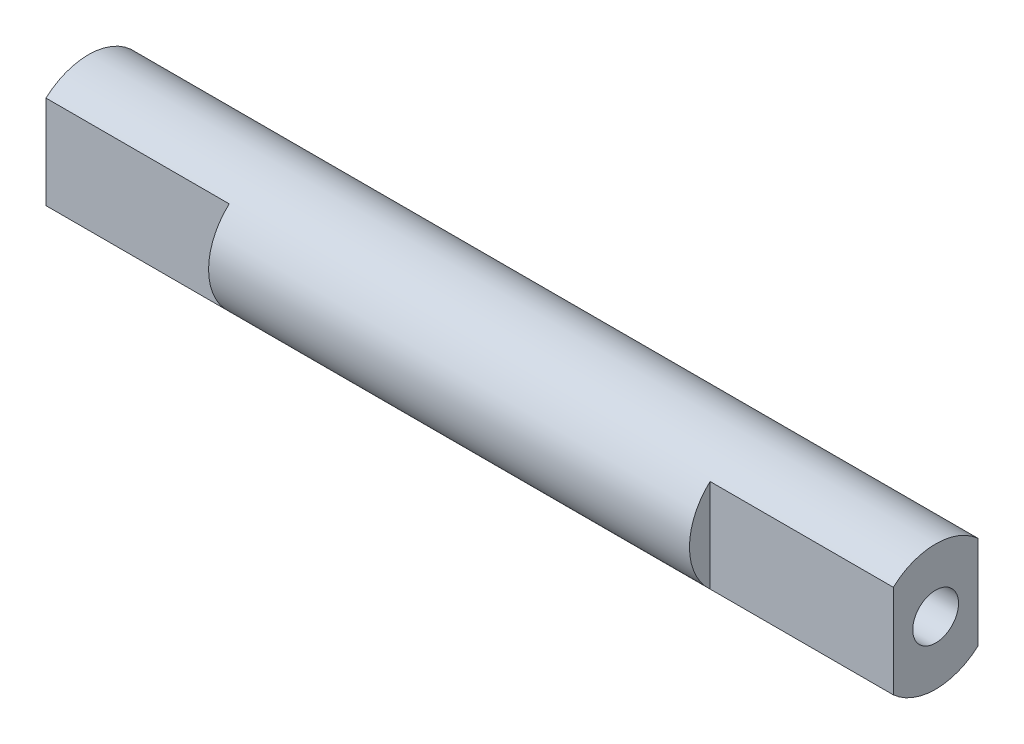
ISO-10303-21;
HEADER;
FILE_DESCRIPTION(('STEP AP214'),'2;1');
FILE_NAME('part.step','',(''),(''),'','','');
FILE_SCHEMA(('AUTOMOTIVE_DESIGN { 1 0 10303 214 1 1 1 1 }'));
ENDSEC;
DATA;
#1=APPLICATION_CONTEXT('core data for automotive mechanical design processes');
#2=APPLICATION_PROTOCOL_DEFINITION('international standard','automotive_design',2000,#1);
#3=PRODUCT_CONTEXT('',#1,'mechanical');
#4=PRODUCT('Part','Part','',(#3));
#5=PRODUCT_RELATED_PRODUCT_CATEGORY('part','',(#4));
#6=PRODUCT_DEFINITION_FORMATION('','',#4);
#7=PRODUCT_DEFINITION_CONTEXT('part definition',#1,'design');
#8=PRODUCT_DEFINITION('design','',#6,#7);
#9=PRODUCT_DEFINITION_SHAPE('','',#8);
#10=(LENGTH_UNIT() NAMED_UNIT(*) SI_UNIT(.MILLI.,.METRE.));
#11=(NAMED_UNIT(*) PLANE_ANGLE_UNIT() SI_UNIT($,.RADIAN.));
#12=(NAMED_UNIT(*) SI_UNIT($,.STERADIAN.) SOLID_ANGLE_UNIT());
#13=UNCERTAINTY_MEASURE_WITH_UNIT(LENGTH_MEASURE(1.E-05),#10,'distance_accuracy_value','');
#14=(GEOMETRIC_REPRESENTATION_CONTEXT(3) GLOBAL_UNCERTAINTY_ASSIGNED_CONTEXT((#13)) GLOBAL_UNIT_ASSIGNED_CONTEXT((#10,
#11,#12)) REPRESENTATION_CONTEXT('',''));
#15=CARTESIAN_POINT('',(0.,0.,0.));
#16=DIRECTION('',(0.,0.,1.));
#17=DIRECTION('',(1.,0.,0.));
#18=AXIS2_PLACEMENT_3D('',#15,#16,#17);
#19=CARTESIAN_POINT('',(18.5,0.,0.));
#20=DIRECTION('',(-1.,0.,0.));
#21=DIRECTION('',(0.,0.,1.));
#22=AXIS2_PLACEMENT_3D('',#19,#20,#21);
#23=CYLINDRICAL_SURFACE('',#22,2.75);
#24=CARTESIAN_POINT('',(18.5,0.,0.));
#25=DIRECTION('',(1.,0.,0.));
#26=DIRECTION('',(0.,0.,-1.));
#27=AXIS2_PLACEMENT_3D('',#24,#25,#26);
#28=CIRCLE('',#27,2.75);
#29=CARTESIAN_POINT('',(18.5,-2.03469899493758,1.85));
#30=VERTEX_POINT('',#29);
#31=CARTESIAN_POINT('',(18.5,-2.03469899493758,-1.85));
#32=VERTEX_POINT('',#31);
#33=EDGE_CURVE('E43',#30,#32,#28,.T.);
#34=ORIENTED_EDGE('',*,*,#33,.F.);
#35=DIRECTION('',(1.,0.,0.));
#36=VECTOR('',#35,1.);
#37=CARTESIAN_POINT('',(10.5,-2.03469899493758,1.85));
#38=LINE('',#37,#36);
#39=CARTESIAN_POINT('',(10.5,-2.03469899493758,1.85));
#40=VERTEX_POINT('',#39);
#41=EDGE_CURVE('E142',#40,#30,#38,.T.);
#42=ORIENTED_EDGE('',*,*,#41,.F.);
#43=CARTESIAN_POINT('',(10.5,0.,0.));
#44=DIRECTION('',(1.,0.,0.));
#45=DIRECTION('',(0.,0.,-1.));
#46=AXIS2_PLACEMENT_3D('',#43,#44,#45);
#47=CIRCLE('',#46,2.75);
#48=CARTESIAN_POINT('',(10.5,2.03469899493758,1.85));
#49=VERTEX_POINT('',#48);
#50=EDGE_CURVE('E136',#49,#40,#47,.T.);
#51=ORIENTED_EDGE('',*,*,#50,.F.);
#52=DIRECTION('',(1.,0.,0.));
#53=VECTOR('',#52,1.);
#54=CARTESIAN_POINT('',(10.5,2.03469899493758,1.85));
#55=LINE('',#54,#53);
#56=CARTESIAN_POINT('',(18.5,2.03469899493758,1.85));
#57=VERTEX_POINT('',#56);
#58=EDGE_CURVE('E145',#49,#57,#55,.T.);
#59=ORIENTED_EDGE('',*,*,#58,.T.);
#60=CARTESIAN_POINT('',(18.5,2.03469899493758,-1.85));
#61=VERTEX_POINT('',#60);
#62=EDGE_CURVE('E11',#61,#57,#28,.T.);
#63=ORIENTED_EDGE('',*,*,#62,.F.);
#64=DIRECTION('',(1.,0.,0.));
#65=VECTOR('',#64,1.);
#66=CARTESIAN_POINT('',(10.5,2.03469899493758,-1.85));
#67=LINE('',#66,#65);
#68=CARTESIAN_POINT('',(10.5,2.03469899493758,-1.85));
#69=VERTEX_POINT('',#68);
#70=EDGE_CURVE('E155',#69,#61,#67,.T.);
#71=ORIENTED_EDGE('',*,*,#70,.F.);
#72=CARTESIAN_POINT('',(10.5,0.,0.));
#73=DIRECTION('',(1.,0.,0.));
#74=DIRECTION('',(0.,0.,-1.));
#75=AXIS2_PLACEMENT_3D('',#72,#73,#74);
#76=CIRCLE('',#75,2.75);
#77=CARTESIAN_POINT('',(10.5,-2.03469899493758,-1.85));
#78=VERTEX_POINT('',#77);
#79=EDGE_CURVE('E150',#78,#69,#76,.T.);
#80=ORIENTED_EDGE('',*,*,#79,.F.);
#81=DIRECTION('',(1.,0.,0.));
#82=VECTOR('',#81,1.);
#83=CARTESIAN_POINT('',(10.5,-2.03469899493758,-1.85));
#84=LINE('',#83,#82);
#85=EDGE_CURVE('E144',#78,#32,#84,.T.);
#86=ORIENTED_EDGE('',*,*,#85,.T.);
#87=EDGE_LOOP('',(#34,#42,#51,#59,#63,#71,#80,#86));
#88=FACE_BOUND('',#87,.T.);
#89=DIRECTION('',(-1.,0.,0.));
#90=VECTOR('',#89,1.);
#91=CARTESIAN_POINT('',(-10.5,2.03469899493758,1.85));
#92=LINE('',#91,#90);
#93=CARTESIAN_POINT('',(-10.5,2.03469899493758,1.85));
#94=VERTEX_POINT('',#93);
#95=CARTESIAN_POINT('',(-18.5,2.03469899493758,1.85));
#96=VERTEX_POINT('',#95);
#97=EDGE_CURVE('E58',#94,#96,#92,.T.);
#98=ORIENTED_EDGE('',*,*,#97,.F.);
#99=CARTESIAN_POINT('',(-10.5,0.,0.));
#100=DIRECTION('',(1.,0.,0.));
#101=DIRECTION('',(0.,0.,-1.));
#102=AXIS2_PLACEMENT_3D('',#99,#100,#101);
#103=CIRCLE('',#102,2.75);
#104=CARTESIAN_POINT('',(-10.5,-2.03469899493758,1.85));
#105=VERTEX_POINT('',#104);
#106=EDGE_CURVE('E105',#94,#105,#103,.T.);
#107=ORIENTED_EDGE('',*,*,#106,.T.);
#108=DIRECTION('',(-1.,0.,0.));
#109=VECTOR('',#108,1.);
#110=CARTESIAN_POINT('',(-10.5,-2.03469899493758,1.85));
#111=LINE('',#110,#109);
#112=CARTESIAN_POINT('',(-18.5,-2.03469899493758,1.85));
#113=VERTEX_POINT('',#112);
#114=EDGE_CURVE('E102',#105,#113,#111,.T.);
#115=ORIENTED_EDGE('',*,*,#114,.T.);
#116=CARTESIAN_POINT('',(-18.5,0.,0.));
#117=DIRECTION('',(1.,0.,0.));
#118=DIRECTION('',(0.,0.,-1.));
#119=AXIS2_PLACEMENT_3D('',#116,#117,#118);
#120=CIRCLE('',#119,2.75);
#121=CARTESIAN_POINT('',(-18.5,-2.03469899493758,-1.85));
#122=VERTEX_POINT('',#121);
#123=EDGE_CURVE('E148',#113,#122,#120,.T.);
#124=ORIENTED_EDGE('',*,*,#123,.T.);
#125=DIRECTION('',(-1.,0.,0.));
#126=VECTOR('',#125,1.);
#127=CARTESIAN_POINT('',(-10.5,-2.03469899493758,-1.85));
#128=LINE('',#127,#126);
#129=CARTESIAN_POINT('',(-10.5,-2.03469899493758,-1.85));
#130=VERTEX_POINT('',#129);
#131=EDGE_CURVE('E50',#130,#122,#128,.T.);
#132=ORIENTED_EDGE('',*,*,#131,.F.);
#133=CARTESIAN_POINT('',(-10.5,0.,0.));
#134=DIRECTION('',(1.,0.,0.));
#135=DIRECTION('',(0.,0.,-1.));
#136=AXIS2_PLACEMENT_3D('',#133,#134,#135);
#137=CIRCLE('',#136,2.75);
#138=CARTESIAN_POINT('',(-10.5,2.03469899493758,-1.85));
#139=VERTEX_POINT('',#138);
#140=EDGE_CURVE('E119',#130,#139,#137,.T.);
#141=ORIENTED_EDGE('',*,*,#140,.T.);
#142=DIRECTION('',(-1.,0.,0.));
#143=VECTOR('',#142,1.);
#144=CARTESIAN_POINT('',(-10.5,2.03469899493758,-1.85));
#145=LINE('',#144,#143);
#146=CARTESIAN_POINT('',(-18.5,2.03469899493758,-1.85));
#147=VERTEX_POINT('',#146);
#148=EDGE_CURVE('E127',#139,#147,#145,.T.);
#149=ORIENTED_EDGE('',*,*,#148,.T.);
#150=EDGE_CURVE('E38',#147,#96,#120,.T.);
#151=ORIENTED_EDGE('',*,*,#150,.T.);
#152=EDGE_LOOP('',(#98,#107,#115,#124,#132,#141,#149,#151));
#153=FACE_BOUND('',#152,.T.);
#154=ADVANCED_FACE('F35',(#88,#153),#23,.T.);
#155=CARTESIAN_POINT('',(-18.5,0.,0.));
#156=DIRECTION('',(1.,0.,0.));
#157=DIRECTION('',(0.,0.,-1.));
#158=AXIS2_PLACEMENT_3D('',#155,#156,#157);
#159=PLANE('',#158);
#160=CARTESIAN_POINT('',(-18.5,0.,0.));
#161=DIRECTION('',(1.,0.,0.));
#162=DIRECTION('',(0.,0.,-1.));
#163=AXIS2_PLACEMENT_3D('',#160,#161,#162);
#164=CIRCLE('',#163,1.);
#165=CARTESIAN_POINT('',(-18.5,0.,-1.));
#166=VERTEX_POINT('',#165);
#167=EDGE_CURVE('E287',#166,#166,#164,.T.);
#168=ORIENTED_EDGE('',*,*,#167,.T.);
#169=EDGE_LOOP('',(#168));
#170=FACE_BOUND('',#169,.T.);
#171=DIRECTION('',(0.,1.,0.));
#172=VECTOR('',#171,1.);
#173=CARTESIAN_POINT('',(-18.5,2.03469899493758,1.85));
#174=LINE('',#173,#172);
#175=EDGE_CURVE('E109',#113,#96,#174,.T.);
#176=ORIENTED_EDGE('',*,*,#175,.T.);
#177=ORIENTED_EDGE('',*,*,#150,.F.);
#178=DIRECTION('',(0.,-1.,0.));
#179=VECTOR('',#178,1.);
#180=CARTESIAN_POINT('',(-18.5,2.03469899493758,-1.85));
#181=LINE('',#180,#179);
#182=EDGE_CURVE('E123',#147,#122,#181,.T.);
#183=ORIENTED_EDGE('',*,*,#182,.T.);
#184=ORIENTED_EDGE('',*,*,#123,.F.);
#185=EDGE_LOOP('',(#176,#177,#183,#184));
#186=FACE_BOUND('',#185,.T.);
#187=ADVANCED_FACE('F192',(#170,#186),#159,.F.);
#188=CARTESIAN_POINT('',(18.5,0.,0.));
#189=DIRECTION('',(1.,0.,0.));
#190=DIRECTION('',(0.,0.,-1.));
#191=AXIS2_PLACEMENT_3D('',#188,#189,#190);
#192=PLANE('',#191);
#193=CARTESIAN_POINT('',(18.5,0.,0.));
#194=DIRECTION('',(1.,0.,0.));
#195=DIRECTION('',(0.,0.,-1.));
#196=AXIS2_PLACEMENT_3D('',#193,#194,#195);
#197=CIRCLE('',#196,1.);
#198=CARTESIAN_POINT('',(18.5,0.,-1.));
#199=VERTEX_POINT('',#198);
#200=EDGE_CURVE('E115',#199,#199,#197,.T.);
#201=ORIENTED_EDGE('',*,*,#200,.F.);
#202=EDGE_LOOP('',(#201));
#203=FACE_BOUND('',#202,.T.);
#204=DIRECTION('',(0.,1.,0.));
#205=VECTOR('',#204,1.);
#206=CARTESIAN_POINT('',(18.5,2.03469899493758,1.85));
#207=LINE('',#206,#205);
#208=EDGE_CURVE('E139',#30,#57,#207,.T.);
#209=ORIENTED_EDGE('',*,*,#208,.F.);
#210=ORIENTED_EDGE('',*,*,#33,.T.);
#211=DIRECTION('',(0.,-1.,0.));
#212=VECTOR('',#211,1.);
#213=CARTESIAN_POINT('',(18.5,2.03469899493758,-1.85));
#214=LINE('',#213,#212);
#215=EDGE_CURVE('E133',#61,#32,#214,.T.);
#216=ORIENTED_EDGE('',*,*,#215,.F.);
#217=ORIENTED_EDGE('',*,*,#62,.T.);
#218=EDGE_LOOP('',(#209,#210,#216,#217));
#219=FACE_BOUND('',#218,.T.);
#220=ADVANCED_FACE('F170',(#203,#219),#192,.T.);
#221=CARTESIAN_POINT('',(10.5,2.03469899493758,-1.85));
#222=DIRECTION('',(0.,0.,1.));
#223=DIRECTION('',(1.,0.,0.));
#224=AXIS2_PLACEMENT_3D('',#221,#222,#223);
#225=PLANE('',#224);
#226=ORIENTED_EDGE('',*,*,#215,.T.);
#227=ORIENTED_EDGE('',*,*,#85,.F.);
#228=DIRECTION('',(0.,-1.,0.));
#229=VECTOR('',#228,1.);
#230=CARTESIAN_POINT('',(10.5,2.03469899493758,-1.85));
#231=LINE('',#230,#229);
#232=EDGE_CURVE('E152',#69,#78,#231,.T.);
#233=ORIENTED_EDGE('',*,*,#232,.F.);
#234=ORIENTED_EDGE('',*,*,#70,.T.);
#235=EDGE_LOOP('',(#226,#227,#233,#234));
#236=FACE_BOUND('',#235,.T.);
#237=ADVANCED_FACE('F163',(#236),#225,.F.);
#238=CARTESIAN_POINT('',(10.5,0.,0.));
#239=DIRECTION('',(1.,0.,0.));
#240=DIRECTION('',(0.,0.,-1.));
#241=AXIS2_PLACEMENT_3D('',#238,#239,#240);
#242=PLANE('',#241);
#243=ORIENTED_EDGE('',*,*,#79,.T.);
#244=ORIENTED_EDGE('',*,*,#232,.T.);
#245=EDGE_LOOP('',(#243,#244));
#246=FACE_BOUND('',#245,.T.);
#247=ADVANCED_FACE('F189',(#246),#242,.T.);
#248=CARTESIAN_POINT('',(10.5,2.03469899493758,1.85));
#249=DIRECTION('',(0.,0.,-1.));
#250=DIRECTION('',(-1.,0.,0.));
#251=AXIS2_PLACEMENT_3D('',#248,#249,#250);
#252=PLANE('',#251);
#253=ORIENTED_EDGE('',*,*,#208,.T.);
#254=ORIENTED_EDGE('',*,*,#58,.F.);
#255=DIRECTION('',(0.,1.,0.));
#256=VECTOR('',#255,1.);
#257=CARTESIAN_POINT('',(10.5,2.03469899493758,1.85));
#258=LINE('',#257,#256);
#259=EDGE_CURVE('E138',#40,#49,#258,.T.);
#260=ORIENTED_EDGE('',*,*,#259,.F.);
#261=ORIENTED_EDGE('',*,*,#41,.T.);
#262=EDGE_LOOP('',(#253,#254,#260,#261));
#263=FACE_BOUND('',#262,.T.);
#264=ADVANCED_FACE('F176',(#263),#252,.F.);
#265=CARTESIAN_POINT('',(10.5,0.,0.));
#266=DIRECTION('',(1.,0.,0.));
#267=DIRECTION('',(0.,0.,-1.));
#268=AXIS2_PLACEMENT_3D('',#265,#266,#267);
#269=PLANE('',#268);
#270=ORIENTED_EDGE('',*,*,#50,.T.);
#271=ORIENTED_EDGE('',*,*,#259,.T.);
#272=EDGE_LOOP('',(#270,#271));
#273=FACE_BOUND('',#272,.T.);
#274=ADVANCED_FACE('F178',(#273),#269,.T.);
#275=CARTESIAN_POINT('',(12.5,0.,0.));
#276=DIRECTION('',(1.,0.,0.));
#277=DIRECTION('',(0.,0.,-1.));
#278=AXIS2_PLACEMENT_3D('',#275,#276,#277);
#279=CYLINDRICAL_SURFACE('',#278,1.);
#280=CARTESIAN_POINT('',(12.5,0.,0.));
#281=DIRECTION('',(1.,0.,0.));
#282=DIRECTION('',(0.,0.,-1.));
#283=AXIS2_PLACEMENT_3D('',#280,#281,#282);
#284=CIRCLE('',#283,1.);
#285=CARTESIAN_POINT('',(12.5,0.,-1.));
#286=VERTEX_POINT('',#285);
#287=EDGE_CURVE('E130',#286,#286,#284,.T.);
#288=ORIENTED_EDGE('',*,*,#287,.F.);
#289=EDGE_LOOP('',(#288));
#290=FACE_BOUND('',#289,.T.);
#291=ORIENTED_EDGE('',*,*,#200,.T.);
#292=EDGE_LOOP('',(#291));
#293=FACE_BOUND('',#292,.T.);
#294=ADVANCED_FACE('F180',(#290,#293),#279,.F.);
#295=CARTESIAN_POINT('',(12.5,0.,0.));
#296=DIRECTION('',(1.,0.,0.));
#297=DIRECTION('',(0.,0.,-1.));
#298=AXIS2_PLACEMENT_3D('',#295,#296,#297);
#299=PLANE('',#298);
#300=ORIENTED_EDGE('',*,*,#287,.T.);
#301=EDGE_LOOP('',(#300));
#302=FACE_BOUND('',#301,.T.);
#303=ADVANCED_FACE('F186',(#302),#299,.T.);
#304=CARTESIAN_POINT('',(-10.5,2.03469899493758,-1.85));
#305=DIRECTION('',(0.,0.,-1.));
#306=DIRECTION('',(-1.,0.,0.));
#307=AXIS2_PLACEMENT_3D('',#304,#305,#306);
#308=PLANE('',#307);
#309=ORIENTED_EDGE('',*,*,#182,.F.);
#310=ORIENTED_EDGE('',*,*,#148,.F.);
#311=DIRECTION('',(0.,-1.,0.));
#312=VECTOR('',#311,1.);
#313=CARTESIAN_POINT('',(-10.5,2.03469899493758,-1.85));
#314=LINE('',#313,#312);
#315=EDGE_CURVE('E122',#139,#130,#314,.T.);
#316=ORIENTED_EDGE('',*,*,#315,.T.);
#317=ORIENTED_EDGE('',*,*,#131,.T.);
#318=EDGE_LOOP('',(#309,#310,#316,#317));
#319=FACE_BOUND('',#318,.T.);
#320=ADVANCED_FACE('F214',(#319),#308,.T.);
#321=CARTESIAN_POINT('',(-10.5,0.,0.));
#322=DIRECTION('',(-1.,0.,0.));
#323=DIRECTION('',(0.,0.,-1.));
#324=AXIS2_PLACEMENT_3D('',#321,#322,#323);
#325=PLANE('',#324);
#326=ORIENTED_EDGE('',*,*,#140,.F.);
#327=ORIENTED_EDGE('',*,*,#315,.F.);
#328=EDGE_LOOP('',(#326,#327));
#329=FACE_BOUND('',#328,.T.);
#330=ADVANCED_FACE('F217',(#329),#325,.T.);
#331=CARTESIAN_POINT('',(-10.5,2.03469899493758,1.85));
#332=DIRECTION('',(0.,0.,1.));
#333=DIRECTION('',(1.,0.,0.));
#334=AXIS2_PLACEMENT_3D('',#331,#332,#333);
#335=PLANE('',#334);
#336=ORIENTED_EDGE('',*,*,#175,.F.);
#337=ORIENTED_EDGE('',*,*,#114,.F.);
#338=DIRECTION('',(0.,1.,0.));
#339=VECTOR('',#338,1.);
#340=CARTESIAN_POINT('',(-10.5,2.03469899493758,1.85));
#341=LINE('',#340,#339);
#342=EDGE_CURVE('E98',#105,#94,#341,.T.);
#343=ORIENTED_EDGE('',*,*,#342,.T.);
#344=ORIENTED_EDGE('',*,*,#97,.T.);
#345=EDGE_LOOP('',(#336,#337,#343,#344));
#346=FACE_BOUND('',#345,.T.);
#347=ADVANCED_FACE('F100',(#346),#335,.T.);
#348=CARTESIAN_POINT('',(-10.5,0.,0.));
#349=DIRECTION('',(-1.,0.,0.));
#350=DIRECTION('',(0.,0.,-1.));
#351=AXIS2_PLACEMENT_3D('',#348,#349,#350);
#352=PLANE('',#351);
#353=ORIENTED_EDGE('',*,*,#106,.F.);
#354=ORIENTED_EDGE('',*,*,#342,.F.);
#355=EDGE_LOOP('',(#353,#354));
#356=FACE_BOUND('',#355,.T.);
#357=ADVANCED_FACE('F107',(#356),#352,.T.);
#358=CARTESIAN_POINT('',(-12.5,0.,0.));
#359=DIRECTION('',(-1.,0.,0.));
#360=DIRECTION('',(0.,0.,1.));
#361=AXIS2_PLACEMENT_3D('',#358,#359,#360);
#362=CYLINDRICAL_SURFACE('',#361,1.);
#363=CARTESIAN_POINT('',(-12.5,0.,0.));
#364=DIRECTION('',(1.,0.,0.));
#365=DIRECTION('',(0.,0.,-1.));
#366=AXIS2_PLACEMENT_3D('',#363,#364,#365);
#367=CIRCLE('',#366,1.);
#368=CARTESIAN_POINT('',(-12.5,0.,-1.));
#369=VERTEX_POINT('',#368);
#370=EDGE_CURVE('E126',#369,#369,#367,.T.);
#371=ORIENTED_EDGE('',*,*,#370,.T.);
#372=EDGE_LOOP('',(#371));
#373=FACE_BOUND('',#372,.T.);
#374=ORIENTED_EDGE('',*,*,#167,.F.);
#375=EDGE_LOOP('',(#374));
#376=FACE_BOUND('',#375,.T.);
#377=ADVANCED_FACE('F263',(#373,#376),#362,.F.);
#378=CARTESIAN_POINT('',(-12.5,0.,0.));
#379=DIRECTION('',(-1.,0.,0.));
#380=DIRECTION('',(0.,0.,-1.));
#381=AXIS2_PLACEMENT_3D('',#378,#379,#380);
#382=PLANE('',#381);
#383=ORIENTED_EDGE('',*,*,#370,.F.);
#384=EDGE_LOOP('',(#383));
#385=FACE_BOUND('',#384,.T.);
#386=ADVANCED_FACE('F271',(#385),#382,.T.);
#387=CLOSED_SHELL('',(#154,#187,#220,#237,#247,#264,#274,#294,#303,#320,#330,#347,#357,#377,#386));
#388=MANIFOLD_SOLID_BREP('B2',#387);
#389=ADVANCED_BREP_SHAPE_REPRESENTATION('',(#18,#388),#14);
#390=SHAPE_DEFINITION_REPRESENTATION(#9,#389);
ENDSEC;
END-ISO-10303-21;
